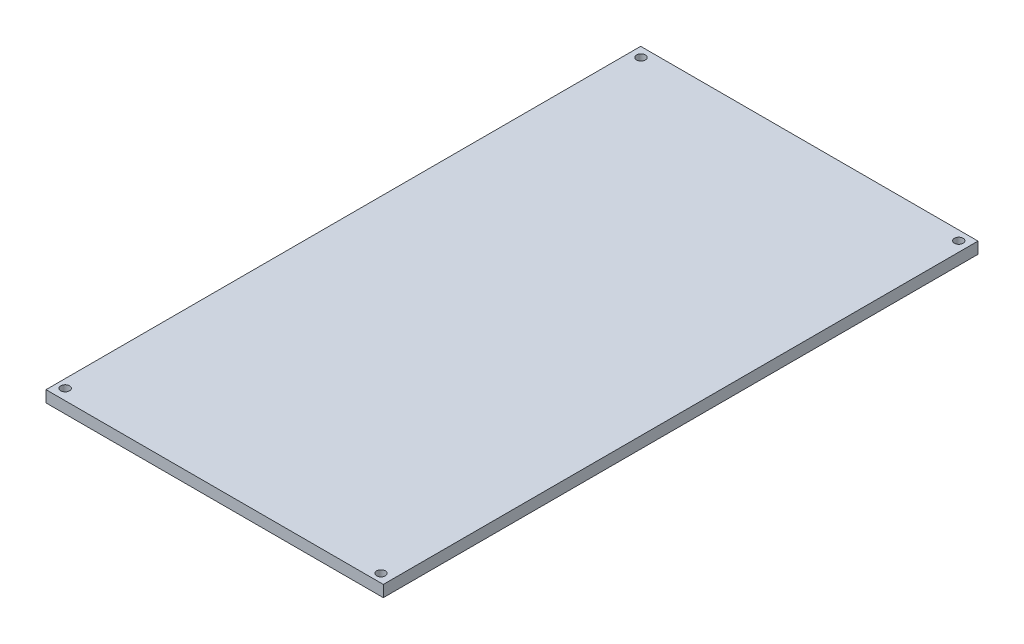
ISO-10303-21;
HEADER;
FILE_DESCRIPTION(('STEP AP214'),'2;1');
FILE_NAME('part.step','',(''),(''),'','','');
FILE_SCHEMA(('AUTOMOTIVE_DESIGN { 1 0 10303 214 1 1 1 1 }'));
ENDSEC;
DATA;
#1=APPLICATION_CONTEXT('core data for automotive mechanical design processes');
#2=APPLICATION_PROTOCOL_DEFINITION('international standard','automotive_design',2000,#1);
#3=PRODUCT_CONTEXT('',#1,'mechanical');
#4=PRODUCT('Part','Part','',(#3));
#5=PRODUCT_RELATED_PRODUCT_CATEGORY('part','',(#4));
#6=PRODUCT_DEFINITION_FORMATION('','',#4);
#7=PRODUCT_DEFINITION_CONTEXT('part definition',#1,'design');
#8=PRODUCT_DEFINITION('design','',#6,#7);
#9=PRODUCT_DEFINITION_SHAPE('','',#8);
#10=(LENGTH_UNIT() NAMED_UNIT(*) SI_UNIT(.MILLI.,.METRE.));
#11=(NAMED_UNIT(*) PLANE_ANGLE_UNIT() SI_UNIT($,.RADIAN.));
#12=(NAMED_UNIT(*) SI_UNIT($,.STERADIAN.) SOLID_ANGLE_UNIT());
#13=UNCERTAINTY_MEASURE_WITH_UNIT(LENGTH_MEASURE(1.E-05),#10,'distance_accuracy_value','');
#14=(GEOMETRIC_REPRESENTATION_CONTEXT(3) GLOBAL_UNCERTAINTY_ASSIGNED_CONTEXT((#13)) GLOBAL_UNIT_ASSIGNED_CONTEXT((#10,
#11,#12)) REPRESENTATION_CONTEXT('',''));
#15=CARTESIAN_POINT('',(0.,0.,0.));
#16=DIRECTION('',(0.,0.,1.));
#17=DIRECTION('',(1.,0.,0.));
#18=AXIS2_PLACEMENT_3D('',#15,#16,#17);
#19=CARTESIAN_POINT('',(0.,3.,0.));
#20=DIRECTION('',(0.,1.,0.));
#21=DIRECTION('',(0.,0.,1.));
#22=AXIS2_PLACEMENT_3D('',#19,#20,#21);
#23=PLANE('',#22);
#24=CARTESIAN_POINT('',(-41.7500027767559,3.,74.6699492552295));
#25=DIRECTION('',(0.,1.,0.));
#26=DIRECTION('',(0.,0.,1.));
#27=AXIS2_PLACEMENT_3D('',#24,#25,#26);
#28=CIRCLE('',#27,1.143);
#29=CARTESIAN_POINT('',(-41.7500027767559,3.,75.8129492552295));
#30=VERTEX_POINT('',#29);
#31=EDGE_CURVE('E155',#30,#30,#28,.T.);
#32=ORIENTED_EDGE('',*,*,#31,.F.);
#33=EDGE_LOOP('',(#32));
#34=FACE_BOUND('',#33,.T.);
#35=CARTESIAN_POINT('',(41.3572448653355,3.,-75.0278335654944));
#36=DIRECTION('',(0.,1.,0.));
#37=DIRECTION('',(0.,0.,1.));
#38=AXIS2_PLACEMENT_3D('',#35,#36,#37);
#39=CIRCLE('',#38,1.143);
#40=CARTESIAN_POINT('',(41.3572448653355,3.,-73.8848335654944));
#41=VERTEX_POINT('',#40);
#42=EDGE_CURVE('E124',#41,#41,#39,.T.);
#43=ORIENTED_EDGE('',*,*,#42,.F.);
#44=EDGE_LOOP('',(#43));
#45=FACE_BOUND('',#44,.T.);
#46=DIRECTION('',(0.,0.,1.));
#47=VECTOR('',#46,1.);
#48=CARTESIAN_POINT('',(-43.942,3.,77.47));
#49=LINE('',#48,#47);
#50=CARTESIAN_POINT('',(-43.942,3.,-77.47));
#51=VERTEX_POINT('',#50);
#52=CARTESIAN_POINT('',(-43.942,3.,77.47));
#53=VERTEX_POINT('',#52);
#54=EDGE_CURVE('E102',#51,#53,#49,.T.);
#55=ORIENTED_EDGE('',*,*,#54,.T.);
#56=DIRECTION('',(1.,0.,0.));
#57=VECTOR('',#56,1.);
#58=CARTESIAN_POINT('',(43.942,3.,77.47));
#59=LINE('',#58,#57);
#60=CARTESIAN_POINT('',(43.942,3.,77.47));
#61=VERTEX_POINT('',#60);
#62=EDGE_CURVE('E97',#53,#61,#59,.T.);
#63=ORIENTED_EDGE('',*,*,#62,.T.);
#64=DIRECTION('',(0.,0.,-1.));
#65=VECTOR('',#64,1.);
#66=CARTESIAN_POINT('',(43.942,3.,77.47));
#67=LINE('',#66,#65);
#68=CARTESIAN_POINT('',(43.942,3.,-77.47));
#69=VERTEX_POINT('',#68);
#70=EDGE_CURVE('E100',#61,#69,#67,.T.);
#71=ORIENTED_EDGE('',*,*,#70,.T.);
#72=DIRECTION('',(-1.,0.,0.));
#73=VECTOR('',#72,1.);
#74=CARTESIAN_POINT('',(43.942,3.,-77.47));
#75=LINE('',#74,#73);
#76=EDGE_CURVE('E67',#69,#51,#75,.T.);
#77=ORIENTED_EDGE('',*,*,#76,.T.);
#78=EDGE_LOOP('',(#55,#63,#71,#77));
#79=FACE_BOUND('',#78,.T.);
#80=CARTESIAN_POINT('',(41.1445562926434,3.,75.2746766287922));
#81=DIRECTION('',(0.,1.,0.));
#82=DIRECTION('',(0.,0.,1.));
#83=AXIS2_PLACEMENT_3D('',#80,#81,#82);
#84=CIRCLE('',#83,1.143);
#85=CARTESIAN_POINT('',(41.1445562926434,3.,76.4176766287922));
#86=VERTEX_POINT('',#85);
#87=EDGE_CURVE('E149',#86,#86,#84,.T.);
#88=ORIENTED_EDGE('',*,*,#87,.F.);
#89=EDGE_LOOP('',(#88));
#90=FACE_BOUND('',#89,.T.);
#91=CARTESIAN_POINT('',(-41.3885342777753,3.,-74.995136608735));
#92=DIRECTION('',(0.,1.,0.));
#93=DIRECTION('',(0.,0.,1.));
#94=AXIS2_PLACEMENT_3D('',#91,#92,#93);
#95=CIRCLE('',#94,1.143);
#96=CARTESIAN_POINT('',(-41.3885342777753,3.,-73.8521366087351));
#97=VERTEX_POINT('',#96);
#98=EDGE_CURVE('E163',#97,#97,#95,.T.);
#99=ORIENTED_EDGE('',*,*,#98,.F.);
#100=EDGE_LOOP('',(#99));
#101=FACE_BOUND('',#100,.T.);
#102=ADVANCED_FACE('F49',(#34,#45,#79,#90,#101),#23,.T.);
#103=CARTESIAN_POINT('',(0.,0.,0.));
#104=DIRECTION('',(0.,1.,0.));
#105=DIRECTION('',(0.,0.,1.));
#106=AXIS2_PLACEMENT_3D('',#103,#104,#105);
#107=PLANE('',#106);
#108=DIRECTION('',(0.,0.,1.));
#109=VECTOR('',#108,1.);
#110=CARTESIAN_POINT('',(-43.942,0.,77.47));
#111=LINE('',#110,#109);
#112=CARTESIAN_POINT('',(-43.942,0.,-77.47));
#113=VERTEX_POINT('',#112);
#114=CARTESIAN_POINT('',(-43.942,0.,77.47));
#115=VERTEX_POINT('',#114);
#116=EDGE_CURVE('E120',#113,#115,#111,.T.);
#117=ORIENTED_EDGE('',*,*,#116,.F.);
#118=DIRECTION('',(-1.,0.,0.));
#119=VECTOR('',#118,1.);
#120=CARTESIAN_POINT('',(43.942,0.,-77.47));
#121=LINE('',#120,#119);
#122=CARTESIAN_POINT('',(43.942,0.,-77.47));
#123=VERTEX_POINT('',#122);
#124=EDGE_CURVE('E90',#123,#113,#121,.T.);
#125=ORIENTED_EDGE('',*,*,#124,.F.);
#126=DIRECTION('',(0.,0.,-1.));
#127=VECTOR('',#126,1.);
#128=CARTESIAN_POINT('',(43.942,0.,77.47));
#129=LINE('',#128,#127);
#130=CARTESIAN_POINT('',(43.942,0.,77.47));
#131=VERTEX_POINT('',#130);
#132=EDGE_CURVE('E84',#131,#123,#129,.T.);
#133=ORIENTED_EDGE('',*,*,#132,.F.);
#134=DIRECTION('',(1.,0.,0.));
#135=VECTOR('',#134,1.);
#136=CARTESIAN_POINT('',(43.942,0.,77.47));
#137=LINE('',#136,#135);
#138=EDGE_CURVE('E107',#115,#131,#137,.T.);
#139=ORIENTED_EDGE('',*,*,#138,.F.);
#140=EDGE_LOOP('',(#117,#125,#133,#139));
#141=FACE_BOUND('',#140,.T.);
#142=CARTESIAN_POINT('',(41.3572448653355,0.,-75.0278335654944));
#143=DIRECTION('',(0.,1.,0.));
#144=DIRECTION('',(0.,0.,1.));
#145=AXIS2_PLACEMENT_3D('',#142,#143,#144);
#146=CIRCLE('',#145,1.143);
#147=CARTESIAN_POINT('',(41.3572448653355,0.,-73.8848335654944));
#148=VERTEX_POINT('',#147);
#149=EDGE_CURVE('E146',#148,#148,#146,.T.);
#150=ORIENTED_EDGE('',*,*,#149,.T.);
#151=EDGE_LOOP('',(#150));
#152=FACE_BOUND('',#151,.T.);
#153=CARTESIAN_POINT('',(41.1445562926434,0.,75.2746766287922));
#154=DIRECTION('',(0.,1.,0.));
#155=DIRECTION('',(0.,0.,1.));
#156=AXIS2_PLACEMENT_3D('',#153,#154,#155);
#157=CIRCLE('',#156,1.143);
#158=CARTESIAN_POINT('',(41.1445562926434,0.,76.4176766287922));
#159=VERTEX_POINT('',#158);
#160=EDGE_CURVE('E152',#159,#159,#157,.T.);
#161=ORIENTED_EDGE('',*,*,#160,.T.);
#162=EDGE_LOOP('',(#161));
#163=FACE_BOUND('',#162,.T.);
#164=CARTESIAN_POINT('',(-41.7500027767559,0.,74.6699492552295));
#165=DIRECTION('',(0.,1.,0.));
#166=DIRECTION('',(0.,0.,1.));
#167=AXIS2_PLACEMENT_3D('',#164,#165,#166);
#168=CIRCLE('',#167,1.143);
#169=CARTESIAN_POINT('',(-41.7500027767559,0.,75.8129492552295));
#170=VERTEX_POINT('',#169);
#171=EDGE_CURVE('E159',#170,#170,#168,.T.);
#172=ORIENTED_EDGE('',*,*,#171,.T.);
#173=EDGE_LOOP('',(#172));
#174=FACE_BOUND('',#173,.T.);
#175=CARTESIAN_POINT('',(-41.3885342777753,0.,-74.995136608735));
#176=DIRECTION('',(0.,1.,0.));
#177=DIRECTION('',(0.,0.,1.));
#178=AXIS2_PLACEMENT_3D('',#175,#176,#177);
#179=CIRCLE('',#178,1.143);
#180=CARTESIAN_POINT('',(-41.3885342777753,0.,-73.8521366087351));
#181=VERTEX_POINT('',#180);
#182=EDGE_CURVE('E167',#181,#181,#179,.T.);
#183=ORIENTED_EDGE('',*,*,#182,.T.);
#184=EDGE_LOOP('',(#183));
#185=FACE_BOUND('',#184,.T.);
#186=ADVANCED_FACE('F139',(#141,#152,#163,#174,#185),#107,.F.);
#187=CARTESIAN_POINT('',(-43.942,3.,77.47));
#188=DIRECTION('',(1.,0.,0.));
#189=DIRECTION('',(0.,0.,-1.));
#190=AXIS2_PLACEMENT_3D('',#187,#188,#189);
#191=PLANE('',#190);
#192=ORIENTED_EDGE('',*,*,#116,.T.);
#193=DIRECTION('',(0.,-1.,0.));
#194=VECTOR('',#193,1.);
#195=CARTESIAN_POINT('',(-43.942,3.,77.47));
#196=LINE('',#195,#194);
#197=EDGE_CURVE('E11',#53,#115,#196,.T.);
#198=ORIENTED_EDGE('',*,*,#197,.F.);
#199=ORIENTED_EDGE('',*,*,#54,.F.);
#200=DIRECTION('',(0.,-1.,0.));
#201=VECTOR('',#200,1.);
#202=CARTESIAN_POINT('',(-43.942,3.,-77.47));
#203=LINE('',#202,#201);
#204=EDGE_CURVE('E116',#51,#113,#203,.T.);
#205=ORIENTED_EDGE('',*,*,#204,.T.);
#206=EDGE_LOOP('',(#192,#198,#199,#205));
#207=FACE_BOUND('',#206,.T.);
#208=ADVANCED_FACE('F51',(#207),#191,.F.);
#209=CARTESIAN_POINT('',(43.942,3.,77.47));
#210=DIRECTION('',(0.,0.,-1.));
#211=DIRECTION('',(-1.,0.,0.));
#212=AXIS2_PLACEMENT_3D('',#209,#210,#211);
#213=PLANE('',#212);
#214=ORIENTED_EDGE('',*,*,#138,.T.);
#215=DIRECTION('',(0.,-1.,0.));
#216=VECTOR('',#215,1.);
#217=CARTESIAN_POINT('',(43.942,3.,77.47));
#218=LINE('',#217,#216);
#219=EDGE_CURVE('E59',#61,#131,#218,.T.);
#220=ORIENTED_EDGE('',*,*,#219,.F.);
#221=ORIENTED_EDGE('',*,*,#62,.F.);
#222=ORIENTED_EDGE('',*,*,#197,.T.);
#223=EDGE_LOOP('',(#214,#220,#221,#222));
#224=FACE_BOUND('',#223,.T.);
#225=ADVANCED_FACE('F106',(#224),#213,.F.);
#226=CARTESIAN_POINT('',(43.942,3.,77.47));
#227=DIRECTION('',(-1.,0.,0.));
#228=DIRECTION('',(0.,0.,1.));
#229=AXIS2_PLACEMENT_3D('',#226,#227,#228);
#230=PLANE('',#229);
#231=ORIENTED_EDGE('',*,*,#132,.T.);
#232=DIRECTION('',(0.,-1.,0.));
#233=VECTOR('',#232,1.);
#234=CARTESIAN_POINT('',(43.942,3.,-77.47));
#235=LINE('',#234,#233);
#236=EDGE_CURVE('E109',#69,#123,#235,.T.);
#237=ORIENTED_EDGE('',*,*,#236,.F.);
#238=ORIENTED_EDGE('',*,*,#70,.F.);
#239=ORIENTED_EDGE('',*,*,#219,.T.);
#240=EDGE_LOOP('',(#231,#237,#238,#239));
#241=FACE_BOUND('',#240,.T.);
#242=ADVANCED_FACE('F110',(#241),#230,.F.);
#243=CARTESIAN_POINT('',(43.942,3.,-77.47));
#244=DIRECTION('',(0.,0.,1.));
#245=DIRECTION('',(1.,0.,0.));
#246=AXIS2_PLACEMENT_3D('',#243,#244,#245);
#247=PLANE('',#246);
#248=ORIENTED_EDGE('',*,*,#124,.T.);
#249=ORIENTED_EDGE('',*,*,#204,.F.);
#250=ORIENTED_EDGE('',*,*,#76,.F.);
#251=ORIENTED_EDGE('',*,*,#236,.T.);
#252=EDGE_LOOP('',(#248,#249,#250,#251));
#253=FACE_BOUND('',#252,.T.);
#254=ADVANCED_FACE('F136',(#253),#247,.F.);
#255=CARTESIAN_POINT('',(41.3572448653355,3.,-75.0278335654944));
#256=DIRECTION('',(0.,-1.,0.));
#257=DIRECTION('',(0.,0.,-1.));
#258=AXIS2_PLACEMENT_3D('',#255,#256,#257);
#259=CYLINDRICAL_SURFACE('',#258,1.143);
#260=ORIENTED_EDGE('',*,*,#42,.T.);
#261=EDGE_LOOP('',(#260));
#262=FACE_BOUND('',#261,.T.);
#263=ORIENTED_EDGE('',*,*,#149,.F.);
#264=EDGE_LOOP('',(#263));
#265=FACE_BOUND('',#264,.T.);
#266=ADVANCED_FACE('F188',(#262,#265),#259,.F.);
#267=CARTESIAN_POINT('',(41.1445562926434,3.,75.2746766287922));
#268=DIRECTION('',(0.,-1.,0.));
#269=DIRECTION('',(0.,0.,-1.));
#270=AXIS2_PLACEMENT_3D('',#267,#268,#269);
#271=CYLINDRICAL_SURFACE('',#270,1.143);
#272=ORIENTED_EDGE('',*,*,#87,.T.);
#273=EDGE_LOOP('',(#272));
#274=FACE_BOUND('',#273,.T.);
#275=ORIENTED_EDGE('',*,*,#160,.F.);
#276=EDGE_LOOP('',(#275));
#277=FACE_BOUND('',#276,.T.);
#278=ADVANCED_FACE('F239',(#274,#277),#271,.F.);
#279=CARTESIAN_POINT('',(-41.7500027767559,3.,74.6699492552295));
#280=DIRECTION('',(0.,-1.,0.));
#281=DIRECTION('',(0.,0.,-1.));
#282=AXIS2_PLACEMENT_3D('',#279,#280,#281);
#283=CYLINDRICAL_SURFACE('',#282,1.143);
#284=ORIENTED_EDGE('',*,*,#31,.T.);
#285=EDGE_LOOP('',(#284));
#286=FACE_BOUND('',#285,.T.);
#287=ORIENTED_EDGE('',*,*,#171,.F.);
#288=EDGE_LOOP('',(#287));
#289=FACE_BOUND('',#288,.T.);
#290=ADVANCED_FACE('F248',(#286,#289),#283,.F.);
#291=CARTESIAN_POINT('',(-41.3885342777753,3.,-74.995136608735));
#292=DIRECTION('',(0.,-1.,0.));
#293=DIRECTION('',(0.,0.,-1.));
#294=AXIS2_PLACEMENT_3D('',#291,#292,#293);
#295=CYLINDRICAL_SURFACE('',#294,1.143);
#296=ORIENTED_EDGE('',*,*,#98,.T.);
#297=EDGE_LOOP('',(#296));
#298=FACE_BOUND('',#297,.T.);
#299=ORIENTED_EDGE('',*,*,#182,.F.);
#300=EDGE_LOOP('',(#299));
#301=FACE_BOUND('',#300,.T.);
#302=ADVANCED_FACE('F176',(#298,#301),#295,.F.);
#303=CLOSED_SHELL('',(#102,#186,#208,#225,#242,#254,#266,#278,#290,#302));
#304=MANIFOLD_SOLID_BREP('B2',#303);
#305=ADVANCED_BREP_SHAPE_REPRESENTATION('',(#18,#304),#14);
#306=SHAPE_DEFINITION_REPRESENTATION(#9,#305);
ENDSEC;
END-ISO-10303-21;
